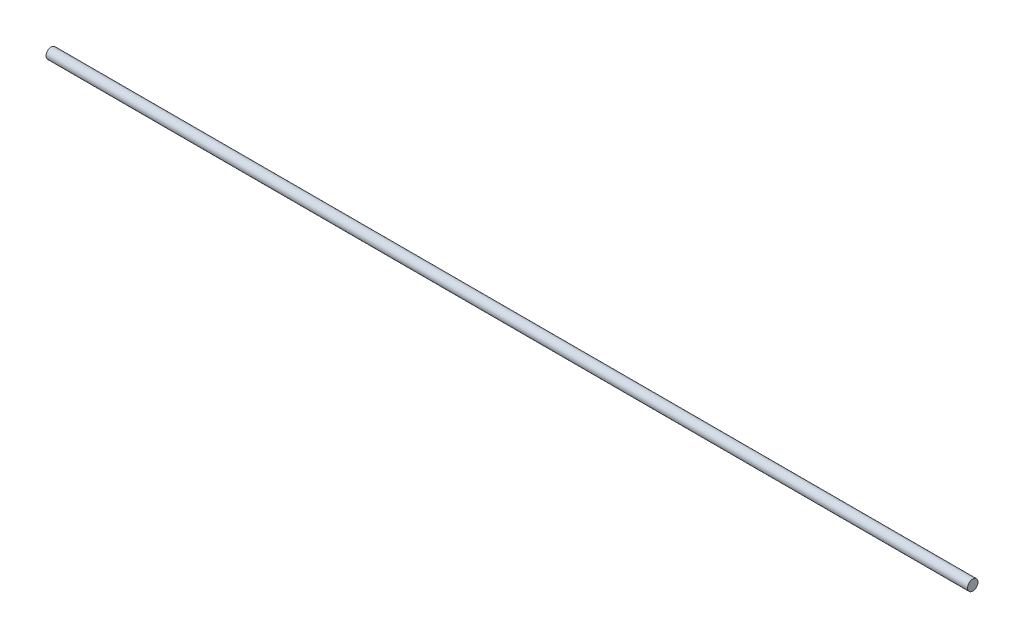
ISO-10303-21;
HEADER;
FILE_DESCRIPTION(('STEP AP214'),'2;1');
FILE_NAME('part.step','',(''),(''),'','','');
FILE_SCHEMA(('AUTOMOTIVE_DESIGN { 1 0 10303 214 1 1 1 1 }'));
ENDSEC;
DATA;
#1=APPLICATION_CONTEXT('core data for automotive mechanical design processes');
#2=APPLICATION_PROTOCOL_DEFINITION('international standard','automotive_design',2000,#1);
#3=PRODUCT_CONTEXT('',#1,'mechanical');
#4=PRODUCT('Part','Part','',(#3));
#5=PRODUCT_RELATED_PRODUCT_CATEGORY('part','',(#4));
#6=PRODUCT_DEFINITION_FORMATION('','',#4);
#7=PRODUCT_DEFINITION_CONTEXT('part definition',#1,'design');
#8=PRODUCT_DEFINITION('design','',#6,#7);
#9=PRODUCT_DEFINITION_SHAPE('','',#8);
#10=(LENGTH_UNIT() NAMED_UNIT(*) SI_UNIT(.MILLI.,.METRE.));
#11=(NAMED_UNIT(*) PLANE_ANGLE_UNIT() SI_UNIT($,.RADIAN.));
#12=(NAMED_UNIT(*) SI_UNIT($,.STERADIAN.) SOLID_ANGLE_UNIT());
#13=UNCERTAINTY_MEASURE_WITH_UNIT(LENGTH_MEASURE(1.E-05),#10,'distance_accuracy_value','');
#14=(GEOMETRIC_REPRESENTATION_CONTEXT(3) GLOBAL_UNCERTAINTY_ASSIGNED_CONTEXT((#13)) GLOBAL_UNIT_ASSIGNED_CONTEXT((#10,
#11,#12)) REPRESENTATION_CONTEXT('',''));
#15=CARTESIAN_POINT('',(0.,0.,0.));
#16=DIRECTION('',(0.,0.,1.));
#17=DIRECTION('',(1.,0.,0.));
#18=AXIS2_PLACEMENT_3D('',#15,#16,#17);
#19=CARTESIAN_POINT('',(1122.1376259541,0.,0.));
#20=DIRECTION('',(-1.,0.,0.));
#21=DIRECTION('',(0.,0.,1.));
#22=AXIS2_PLACEMENT_3D('',#19,#20,#21);
#23=CYLINDRICAL_SURFACE('',#22,6.35);
#24=CARTESIAN_POINT('',(1122.1376259541,0.,0.));
#25=DIRECTION('',(1.,0.,0.));
#26=DIRECTION('',(0.,0.,-1.));
#27=AXIS2_PLACEMENT_3D('',#24,#25,#26);
#28=CIRCLE('',#27,6.35);
#29=CARTESIAN_POINT('',(1122.1376259541,0.,-6.35));
#30=VERTEX_POINT('',#29);
#31=EDGE_CURVE('E11',#30,#30,#28,.T.);
#32=ORIENTED_EDGE('',*,*,#31,.F.);
#33=EDGE_LOOP('',(#32));
#34=FACE_BOUND('',#33,.T.);
#35=CARTESIAN_POINT('',(0.,0.,0.));
#36=DIRECTION('',(1.,0.,0.));
#37=DIRECTION('',(0.,0.,-1.));
#38=AXIS2_PLACEMENT_3D('',#35,#36,#37);
#39=CIRCLE('',#38,6.35);
#40=CARTESIAN_POINT('',(0.,0.,-6.35));
#41=VERTEX_POINT('',#40);
#42=EDGE_CURVE('E47',#41,#41,#39,.T.);
#43=ORIENTED_EDGE('',*,*,#42,.T.);
#44=EDGE_LOOP('',(#43));
#45=FACE_BOUND('',#44,.T.);
#46=ADVANCED_FACE('F46',(#34,#45),#23,.T.);
#47=CARTESIAN_POINT('',(1122.1376259541,0.,0.));
#48=DIRECTION('',(1.,0.,0.));
#49=DIRECTION('',(0.,0.,-1.));
#50=AXIS2_PLACEMENT_3D('',#47,#48,#49);
#51=PLANE('',#50);
#52=ORIENTED_EDGE('',*,*,#31,.T.);
#53=EDGE_LOOP('',(#52));
#54=FACE_BOUND('',#53,.T.);
#55=ADVANCED_FACE('F61',(#54),#51,.T.);
#56=CARTESIAN_POINT('',(0.,0.,0.));
#57=DIRECTION('',(1.,0.,0.));
#58=DIRECTION('',(0.,0.,-1.));
#59=AXIS2_PLACEMENT_3D('',#56,#57,#58);
#60=PLANE('',#59);
#61=ORIENTED_EDGE('',*,*,#42,.F.);
#62=EDGE_LOOP('',(#61));
#63=FACE_BOUND('',#62,.T.);
#64=ADVANCED_FACE('F64',(#63),#60,.F.);
#65=CLOSED_SHELL('',(#46,#55,#64));
#66=MANIFOLD_SOLID_BREP('B2',#65);
#67=ADVANCED_BREP_SHAPE_REPRESENTATION('',(#18,#66),#14);
#68=SHAPE_DEFINITION_REPRESENTATION(#9,#67);
ENDSEC;
END-ISO-10303-21;
